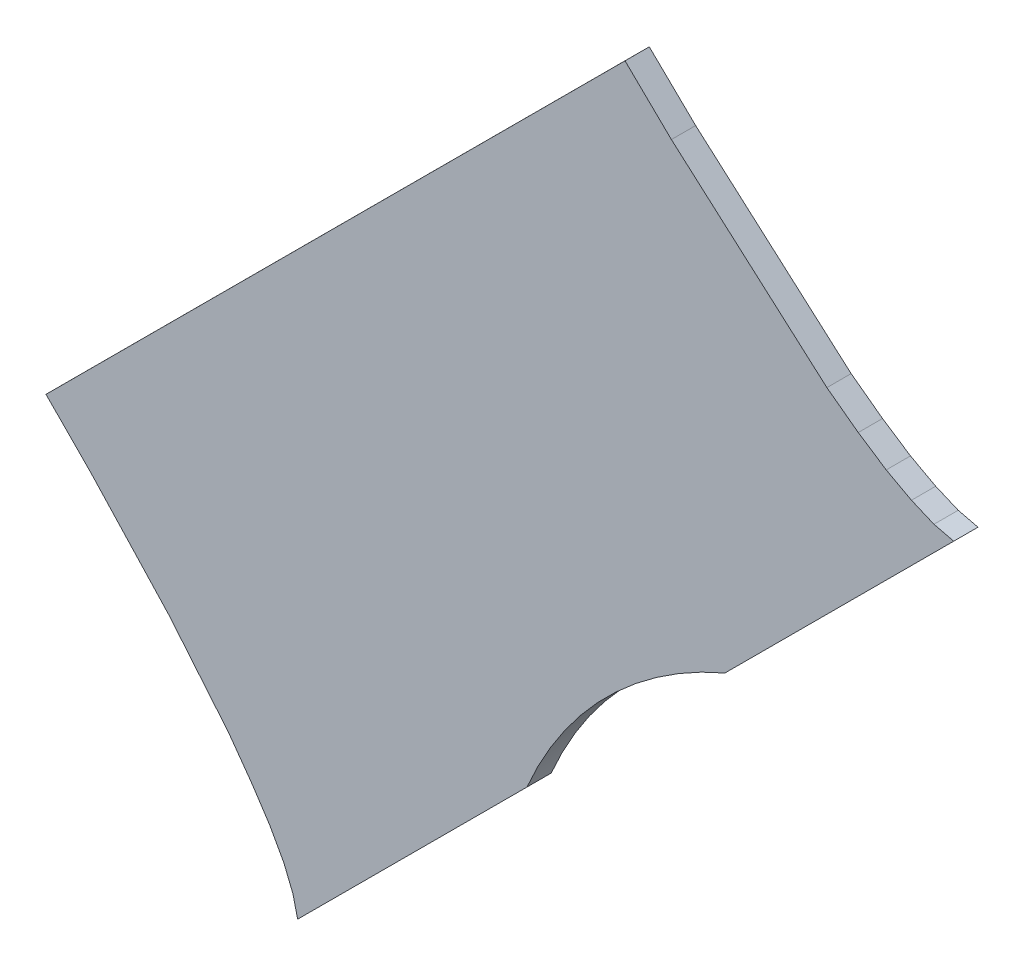
ISO-10303-21;
HEADER;
FILE_DESCRIPTION(('STEP AP214'),'2;1');
FILE_NAME('part.step','',(''),(''),'','','');
FILE_SCHEMA(('AUTOMOTIVE_DESIGN { 1 0 10303 214 1 1 1 1 }'));
ENDSEC;
DATA;
#1=APPLICATION_CONTEXT('core data for automotive mechanical design processes');
#2=APPLICATION_PROTOCOL_DEFINITION('international standard','automotive_design',2000,#1);
#3=PRODUCT_CONTEXT('',#1,'mechanical');
#4=PRODUCT('Part','Part','',(#3));
#5=PRODUCT_RELATED_PRODUCT_CATEGORY('part','',(#4));
#6=PRODUCT_DEFINITION_FORMATION('','',#4);
#7=PRODUCT_DEFINITION_CONTEXT('part definition',#1,'design');
#8=PRODUCT_DEFINITION('design','',#6,#7);
#9=PRODUCT_DEFINITION_SHAPE('','',#8);
#10=(LENGTH_UNIT() NAMED_UNIT(*) SI_UNIT(.MILLI.,.METRE.));
#11=(NAMED_UNIT(*) PLANE_ANGLE_UNIT() SI_UNIT($,.RADIAN.));
#12=(NAMED_UNIT(*) SI_UNIT($,.STERADIAN.) SOLID_ANGLE_UNIT());
#13=UNCERTAINTY_MEASURE_WITH_UNIT(LENGTH_MEASURE(1.E-05),#10,'distance_accuracy_value','');
#14=(GEOMETRIC_REPRESENTATION_CONTEXT(3) GLOBAL_UNCERTAINTY_ASSIGNED_CONTEXT((#13)) GLOBAL_UNIT_ASSIGNED_CONTEXT((#10,
#11,#12)) REPRESENTATION_CONTEXT('',''));
#15=CARTESIAN_POINT('',(0.,0.,0.));
#16=DIRECTION('',(0.,0.,1.));
#17=DIRECTION('',(1.,0.,0.));
#18=AXIS2_PLACEMENT_3D('',#15,#16,#17);
#19=CARTESIAN_POINT('',(85.379997253418,71.8410034179688,0.));
#20=DIRECTION('',(0.706693389429742,-0.707519931405683,0.));
#21=DIRECTION('',(-0.707519931405683,-0.706693389429742,0.));
#22=AXIS2_PLACEMENT_3D('',#19,#20,#21);
#23=PLANE('',#22);
#24=DIRECTION('',(-0.707519931405683,-0.706693389429742,0.));
#25=VECTOR('',#24,1.);
#26=CARTESIAN_POINT('',(85.379997253418,71.8410034179688,0.03556));
#27=LINE('',#26,#25);
#28=CARTESIAN_POINT('',(85.379997253418,71.8410034179688,0.03556));
#29=VERTEX_POINT('',#28);
#30=CARTESIAN_POINT('',(84.5309982299805,70.9929962158203,0.03556));
#31=VERTEX_POINT('',#30);
#32=EDGE_CURVE('E11',#29,#31,#27,.T.);
#33=ORIENTED_EDGE('',*,*,#32,.F.);
#34=DIRECTION('',(0.,0.,1.));
#35=VECTOR('',#34,1.);
#36=CARTESIAN_POINT('',(85.379997253418,71.8410034179688,0.));
#37=LINE('',#36,#35);
#38=CARTESIAN_POINT('',(85.379997253418,71.8410034179688,0.));
#39=VERTEX_POINT('',#38);
#40=EDGE_CURVE('E24',#39,#29,#37,.T.);
#41=ORIENTED_EDGE('',*,*,#40,.F.);
#42=DIRECTION('',(-0.707519931405683,-0.706693389429742,0.));
#43=VECTOR('',#42,1.);
#44=CARTESIAN_POINT('',(85.379997253418,71.8410034179688,0.));
#45=LINE('',#44,#43);
#46=CARTESIAN_POINT('',(84.5309982299805,70.9929962158203,0.));
#47=VERTEX_POINT('',#46);
#48=EDGE_CURVE('E297',#39,#47,#45,.T.);
#49=ORIENTED_EDGE('',*,*,#48,.T.);
#50=DIRECTION('',(0.,0.,1.));
#51=VECTOR('',#50,1.);
#52=CARTESIAN_POINT('',(84.5309982299805,70.9929962158203,0.));
#53=LINE('',#52,#51);
#54=EDGE_CURVE('E37',#47,#31,#53,.T.);
#55=ORIENTED_EDGE('',*,*,#54,.T.);
#56=EDGE_LOOP('',(#33,#41,#49,#55));
#57=FACE_BOUND('',#56,.T.);
#58=ADVANCED_FACE('F17',(#57),#23,.F.);
#59=CARTESIAN_POINT('',(85.447998046875,71.7750015258789,0.));
#60=DIRECTION('',(-0.69648147357691,-0.717574774475899,0.));
#61=DIRECTION('',(-0.717574774475899,0.69648147357691,0.));
#62=AXIS2_PLACEMENT_3D('',#59,#60,#61);
#63=PLANE('',#62);
#64=DIRECTION('',(-0.717574774475898,0.69648147357691,0.));
#65=VECTOR('',#64,1.);
#66=CARTESIAN_POINT('',(85.447998046875,71.7750015258789,0.03556));
#67=LINE('',#66,#65);
#68=CARTESIAN_POINT('',(85.447998046875,71.7750015258789,0.03556));
#69=VERTEX_POINT('',#68);
#70=EDGE_CURVE('E293',#69,#29,#67,.T.);
#71=ORIENTED_EDGE('',*,*,#70,.F.);
#72=DIRECTION('',(0.,0.,1.));
#73=VECTOR('',#72,1.);
#74=CARTESIAN_POINT('',(85.447998046875,71.7750015258789,0.));
#75=LINE('',#74,#73);
#76=CARTESIAN_POINT('',(85.447998046875,71.7750015258789,0.));
#77=VERTEX_POINT('',#76);
#78=EDGE_CURVE('E291',#77,#69,#75,.T.);
#79=ORIENTED_EDGE('',*,*,#78,.F.);
#80=DIRECTION('',(-0.717574774475898,0.69648147357691,0.));
#81=VECTOR('',#80,1.);
#82=CARTESIAN_POINT('',(85.447998046875,71.7750015258789,0.));
#83=LINE('',#82,#81);
#84=EDGE_CURVE('E289',#77,#39,#83,.T.);
#85=ORIENTED_EDGE('',*,*,#84,.T.);
#86=ORIENTED_EDGE('',*,*,#40,.T.);
#87=EDGE_LOOP('',(#71,#79,#85,#86));
#88=FACE_BOUND('',#87,.T.);
#89=ADVANCED_FACE('F300',(#88),#63,.F.);
#90=CARTESIAN_POINT('',(85.6760025024414,71.5739974975586,0.));
#91=DIRECTION('',(-0.661295318004466,-0.750125657730338,0.));
#92=DIRECTION('',(-0.750125657730338,0.661295318004466,0.));
#93=AXIS2_PLACEMENT_3D('',#90,#91,#92);
#94=PLANE('',#93);
#95=DIRECTION('',(-0.750125657730338,0.661295318004466,0.));
#96=VECTOR('',#95,1.);
#97=CARTESIAN_POINT('',(85.6760025024414,71.5739974975586,0.03556));
#98=LINE('',#97,#96);
#99=CARTESIAN_POINT('',(85.6760025024414,71.5739974975586,0.03556));
#100=VERTEX_POINT('',#99);
#101=EDGE_CURVE('E286',#100,#69,#98,.T.);
#102=ORIENTED_EDGE('',*,*,#101,.F.);
#103=DIRECTION('',(0.,0.,1.));
#104=VECTOR('',#103,1.);
#105=CARTESIAN_POINT('',(85.6760025024414,71.5739974975586,0.));
#106=LINE('',#105,#104);
#107=CARTESIAN_POINT('',(85.6760025024414,71.5739974975586,0.));
#108=VERTEX_POINT('',#107);
#109=EDGE_CURVE('E284',#108,#100,#106,.T.);
#110=ORIENTED_EDGE('',*,*,#109,.F.);
#111=DIRECTION('',(-0.750125657730338,0.661295318004466,0.));
#112=VECTOR('',#111,1.);
#113=CARTESIAN_POINT('',(85.6760025024414,71.5739974975586,0.));
#114=LINE('',#113,#112);
#115=EDGE_CURVE('E281',#108,#77,#114,.T.);
#116=ORIENTED_EDGE('',*,*,#115,.T.);
#117=ORIENTED_EDGE('',*,*,#78,.T.);
#118=EDGE_LOOP('',(#102,#110,#116,#117));
#119=FACE_BOUND('',#118,.T.);
#120=ADVANCED_FACE('F303',(#119),#94,.F.);
#121=CARTESIAN_POINT('',(85.7220001220703,71.5400009155273,0.));
#122=DIRECTION('',(-0.594372308476259,-0.804190001751205,0.));
#123=DIRECTION('',(-0.804190001751205,0.594372308476259,0.));
#124=AXIS2_PLACEMENT_3D('',#121,#122,#123);
#125=PLANE('',#124);
#126=DIRECTION('',(-0.804190001751205,0.594372308476259,0.));
#127=VECTOR('',#126,1.);
#128=CARTESIAN_POINT('',(85.7220001220703,71.5400009155273,0.03556));
#129=LINE('',#128,#127);
#130=CARTESIAN_POINT('',(85.7220001220703,71.5400009155273,0.03556));
#131=VERTEX_POINT('',#130);
#132=EDGE_CURVE('E278',#131,#100,#129,.T.);
#133=ORIENTED_EDGE('',*,*,#132,.F.);
#134=DIRECTION('',(0.,0.,1.));
#135=VECTOR('',#134,1.);
#136=CARTESIAN_POINT('',(85.7220001220703,71.5400009155273,0.));
#137=LINE('',#136,#135);
#138=CARTESIAN_POINT('',(85.7220001220703,71.5400009155273,0.));
#139=VERTEX_POINT('',#138);
#140=EDGE_CURVE('E276',#139,#131,#137,.T.);
#141=ORIENTED_EDGE('',*,*,#140,.F.);
#142=DIRECTION('',(-0.804190001751205,0.594372308476259,0.));
#143=VECTOR('',#142,1.);
#144=CARTESIAN_POINT('',(85.7220001220703,71.5400009155273,0.));
#145=LINE('',#144,#143);
#146=EDGE_CURVE('E273',#139,#108,#145,.T.);
#147=ORIENTED_EDGE('',*,*,#146,.T.);
#148=ORIENTED_EDGE('',*,*,#109,.T.);
#149=EDGE_LOOP('',(#133,#141,#147,#148));
#150=FACE_BOUND('',#149,.T.);
#151=ADVANCED_FACE('F308',(#150),#125,.F.);
#152=CARTESIAN_POINT('',(85.7630004882812,71.5130004882812,0.));
#153=DIRECTION('',(-0.549993213403991,-0.835169123716599,0.));
#154=DIRECTION('',(-0.835169123716599,0.549993213403991,0.));
#155=AXIS2_PLACEMENT_3D('',#152,#153,#154);
#156=PLANE('',#155);
#157=DIRECTION('',(-0.835169123716599,0.549993213403991,0.));
#158=VECTOR('',#157,1.);
#159=CARTESIAN_POINT('',(85.7630004882812,71.5130004882812,0.03556));
#160=LINE('',#159,#158);
#161=CARTESIAN_POINT('',(85.7630004882812,71.5130004882812,0.03556));
#162=VERTEX_POINT('',#161);
#163=EDGE_CURVE('E270',#162,#131,#160,.T.);
#164=ORIENTED_EDGE('',*,*,#163,.F.);
#165=DIRECTION('',(0.,0.,1.));
#166=VECTOR('',#165,1.);
#167=CARTESIAN_POINT('',(85.7630004882812,71.5130004882812,0.));
#168=LINE('',#167,#166);
#169=CARTESIAN_POINT('',(85.7630004882812,71.5130004882812,0.));
#170=VERTEX_POINT('',#169);
#171=EDGE_CURVE('E268',#170,#162,#168,.T.);
#172=ORIENTED_EDGE('',*,*,#171,.F.);
#173=DIRECTION('',(-0.835169123716599,0.549993213403991,0.));
#174=VECTOR('',#173,1.);
#175=CARTESIAN_POINT('',(85.7630004882812,71.5130004882812,0.));
#176=LINE('',#175,#174);
#177=EDGE_CURVE('E265',#170,#139,#176,.T.);
#178=ORIENTED_EDGE('',*,*,#177,.T.);
#179=ORIENTED_EDGE('',*,*,#140,.T.);
#180=EDGE_LOOP('',(#164,#172,#178,#179));
#181=FACE_BOUND('',#180,.T.);
#182=ADVANCED_FACE('F311',(#181),#156,.F.);
#183=CARTESIAN_POINT('',(85.8000030517578,71.4929962158203,0.));
#184=DIRECTION('',(-0.475570144418548,-0.879677803367643,0.));
#185=DIRECTION('',(-0.879677803367643,0.475570144418548,0.));
#186=AXIS2_PLACEMENT_3D('',#183,#184,#185);
#187=PLANE('',#186);
#188=DIRECTION('',(-0.879677803367643,0.475570144418548,0.));
#189=VECTOR('',#188,1.);
#190=CARTESIAN_POINT('',(85.8000030517578,71.4929962158203,0.03556));
#191=LINE('',#190,#189);
#192=CARTESIAN_POINT('',(85.8000030517578,71.4929962158203,0.03556));
#193=VERTEX_POINT('',#192);
#194=EDGE_CURVE('E262',#193,#162,#191,.T.);
#195=ORIENTED_EDGE('',*,*,#194,.F.);
#196=DIRECTION('',(0.,0.,1.));
#197=VECTOR('',#196,1.);
#198=CARTESIAN_POINT('',(85.8000030517578,71.4929962158203,0.));
#199=LINE('',#198,#197);
#200=CARTESIAN_POINT('',(85.8000030517578,71.4929962158203,0.));
#201=VERTEX_POINT('',#200);
#202=EDGE_CURVE('E260',#201,#193,#199,.T.);
#203=ORIENTED_EDGE('',*,*,#202,.F.);
#204=DIRECTION('',(-0.879677803367643,0.475570144418548,0.));
#205=VECTOR('',#204,1.);
#206=CARTESIAN_POINT('',(85.8000030517578,71.4929962158203,0.));
#207=LINE('',#206,#205);
#208=EDGE_CURVE('E257',#201,#170,#207,.T.);
#209=ORIENTED_EDGE('',*,*,#208,.T.);
#210=ORIENTED_EDGE('',*,*,#171,.T.);
#211=EDGE_LOOP('',(#195,#203,#209,#210));
#212=FACE_BOUND('',#211,.T.);
#213=ADVANCED_FACE('F316',(#212),#187,.F.);
#214=CARTESIAN_POINT('',(85.8330001831055,71.4789962768555,0.));
#215=DIRECTION('',(-0.390577177437888,-0.920570186604287,0.));
#216=DIRECTION('',(-0.920570186604287,0.390577177437888,0.));
#217=AXIS2_PLACEMENT_3D('',#214,#215,#216);
#218=PLANE('',#217);
#219=DIRECTION('',(-0.920570186604287,0.390577177437888,0.));
#220=VECTOR('',#219,1.);
#221=CARTESIAN_POINT('',(85.8330001831055,71.4789962768555,0.03556));
#222=LINE('',#221,#220);
#223=CARTESIAN_POINT('',(85.8330001831055,71.4789962768555,0.03556));
#224=VERTEX_POINT('',#223);
#225=EDGE_CURVE('E254',#224,#193,#222,.T.);
#226=ORIENTED_EDGE('',*,*,#225,.F.);
#227=DIRECTION('',(0.,0.,1.));
#228=VECTOR('',#227,1.);
#229=CARTESIAN_POINT('',(85.8330001831055,71.4789962768555,0.));
#230=LINE('',#229,#228);
#231=CARTESIAN_POINT('',(85.8330001831055,71.4789962768555,0.));
#232=VERTEX_POINT('',#231);
#233=EDGE_CURVE('E252',#232,#224,#230,.T.);
#234=ORIENTED_EDGE('',*,*,#233,.F.);
#235=DIRECTION('',(-0.920570186604287,0.390577177437888,0.));
#236=VECTOR('',#235,1.);
#237=CARTESIAN_POINT('',(85.8330001831055,71.4789962768555,0.));
#238=LINE('',#237,#236);
#239=EDGE_CURVE('E249',#232,#201,#238,.T.);
#240=ORIENTED_EDGE('',*,*,#239,.T.);
#241=ORIENTED_EDGE('',*,*,#202,.T.);
#242=EDGE_LOOP('',(#226,#234,#240,#241));
#243=FACE_BOUND('',#242,.T.);
#244=ADVANCED_FACE('F319',(#243),#218,.F.);
#245=CARTESIAN_POINT('',(85.8619995117188,71.4720001220703,0.));
#246=DIRECTION('',(-0.234523862882791,-0.972110362941644,0.));
#247=DIRECTION('',(-0.972110362941644,0.234523862882791,0.));
#248=AXIS2_PLACEMENT_3D('',#245,#246,#247);
#249=PLANE('',#248);
#250=DIRECTION('',(-0.972110362941644,0.234523862882791,0.));
#251=VECTOR('',#250,1.);
#252=CARTESIAN_POINT('',(85.8619995117188,71.4720001220703,0.03556));
#253=LINE('',#252,#251);
#254=CARTESIAN_POINT('',(85.8619995117188,71.4720001220703,0.03556));
#255=VERTEX_POINT('',#254);
#256=EDGE_CURVE('E246',#255,#224,#253,.T.);
#257=ORIENTED_EDGE('',*,*,#256,.F.);
#258=DIRECTION('',(0.,0.,1.));
#259=VECTOR('',#258,1.);
#260=CARTESIAN_POINT('',(85.8619995117188,71.4720001220703,0.));
#261=LINE('',#260,#259);
#262=CARTESIAN_POINT('',(85.8619995117188,71.4720001220703,0.));
#263=VERTEX_POINT('',#262);
#264=EDGE_CURVE('E244',#263,#255,#261,.T.);
#265=ORIENTED_EDGE('',*,*,#264,.F.);
#266=DIRECTION('',(-0.972110362941644,0.234523862882791,0.));
#267=VECTOR('',#266,1.);
#268=CARTESIAN_POINT('',(85.8619995117188,71.4720001220703,0.));
#269=LINE('',#268,#267);
#270=EDGE_CURVE('E241',#263,#232,#269,.T.);
#271=ORIENTED_EDGE('',*,*,#270,.T.);
#272=ORIENTED_EDGE('',*,*,#233,.T.);
#273=EDGE_LOOP('',(#257,#265,#271,#272));
#274=FACE_BOUND('',#273,.T.);
#275=ADVANCED_FACE('F324',(#274),#249,.F.);
#276=CARTESIAN_POINT('',(85.5265213490849,71.136870498502,0.));
#277=DIRECTION('',(-0.70673917682214,0.707474194543351,0.));
#278=DIRECTION('',(0.707474194543351,0.70673917682214,0.));
#279=AXIS2_PLACEMENT_3D('',#276,#277,#278);
#280=PLANE('',#279);
#281=DIRECTION('',(0.707474194543351,0.70673917682214,0.));
#282=VECTOR('',#281,1.);
#283=CARTESIAN_POINT('',(84.9000015258789,70.5110015869141,0.03556));
#284=LINE('',#283,#282);
#285=CARTESIAN_POINT('',(85.5265213490849,71.136870498502,0.03556));
#286=VERTEX_POINT('',#285);
#287=EDGE_CURVE('E238',#286,#255,#284,.T.);
#288=ORIENTED_EDGE('',*,*,#287,.F.);
#289=DIRECTION('',(0.,0.,1.));
#290=VECTOR('',#289,1.);
#291=CARTESIAN_POINT('',(85.5265213490849,71.136870498502,0.));
#292=LINE('',#291,#290);
#293=CARTESIAN_POINT('',(85.5265213490849,71.136870498502,0.));
#294=VERTEX_POINT('',#293);
#295=EDGE_CURVE('E236',#294,#286,#292,.T.);
#296=ORIENTED_EDGE('',*,*,#295,.F.);
#297=DIRECTION('',(0.707474194543351,0.70673917682214,0.));
#298=VECTOR('',#297,1.);
#299=CARTESIAN_POINT('',(84.9000015258789,70.5110015869141,0.));
#300=LINE('',#299,#298);
#301=EDGE_CURVE('E233',#294,#263,#300,.T.);
#302=ORIENTED_EDGE('',*,*,#301,.T.);
#303=ORIENTED_EDGE('',*,*,#264,.T.);
#304=EDGE_LOOP('',(#288,#296,#302,#303));
#305=FACE_BOUND('',#304,.T.);
#306=ADVANCED_FACE('F327',(#305),#280,.F.);
#307=CARTESIAN_POINT('',(85.742018,70.6308468,0.));
#308=DIRECTION('',(0.,0.,-1.));
#309=DIRECTION('',(1.,0.,0.));
#310=AXIS2_PLACEMENT_3D('',#307,#308,#309);
#311=CYLINDRICAL_SURFACE('',#310,0.5499989);
#312=ORIENTED_EDGE('',*,*,#295,.T.);
#313=CARTESIAN_POINT('',(85.742018,70.6308468,0.03556));
#314=DIRECTION('',(0.,0.,1.));
#315=DIRECTION('',(1.,0.,0.));
#316=AXIS2_PLACEMENT_3D('',#313,#314,#315);
#317=CIRCLE('',#316,0.5499989);
#318=CARTESIAN_POINT('',(85.2362185775888,70.8468693319028,0.03556));
#319=VERTEX_POINT('',#318);
#320=EDGE_CURVE('E230',#286,#319,#317,.T.);
#321=ORIENTED_EDGE('',*,*,#320,.T.);
#322=DIRECTION('',(0.,0.,1.));
#323=VECTOR('',#322,1.);
#324=CARTESIAN_POINT('',(85.2362185775888,70.8468693319028,0.));
#325=LINE('',#324,#323);
#326=CARTESIAN_POINT('',(85.2362185775888,70.8468693319028,0.));
#327=VERTEX_POINT('',#326);
#328=EDGE_CURVE('E228',#327,#319,#325,.T.);
#329=ORIENTED_EDGE('',*,*,#328,.F.);
#330=CARTESIAN_POINT('',(85.742018,70.6308468,0.));
#331=DIRECTION('',(0.,0.,1.));
#332=DIRECTION('',(1.,0.,0.));
#333=AXIS2_PLACEMENT_3D('',#330,#331,#332);
#334=CIRCLE('',#333,0.5499989);
#335=EDGE_CURVE('E225',#294,#327,#334,.T.);
#336=ORIENTED_EDGE('',*,*,#335,.F.);
#337=EDGE_LOOP('',(#312,#321,#329,#336));
#338=FACE_BOUND('',#337,.T.);
#339=ADVANCED_FACE('F333',(#338),#311,.F.);
#340=CARTESIAN_POINT('',(84.9000015258789,70.5110015869141,0.));
#341=DIRECTION('',(-0.70673917682214,0.707474194543351,0.));
#342=DIRECTION('',(0.707474194543351,0.70673917682214,0.));
#343=AXIS2_PLACEMENT_3D('',#340,#341,#342);
#344=PLANE('',#343);
#345=DIRECTION('',(0.707474194543351,0.70673917682214,0.));
#346=VECTOR('',#345,1.);
#347=CARTESIAN_POINT('',(84.9000015258789,70.5110015869141,0.03556));
#348=LINE('',#347,#346);
#349=CARTESIAN_POINT('',(84.9000015258789,70.5110015869141,0.03556));
#350=VERTEX_POINT('',#349);
#351=EDGE_CURVE('E222',#350,#319,#348,.T.);
#352=ORIENTED_EDGE('',*,*,#351,.F.);
#353=DIRECTION('',(0.,0.,1.));
#354=VECTOR('',#353,1.);
#355=CARTESIAN_POINT('',(84.9000015258789,70.5110015869141,0.));
#356=LINE('',#355,#354);
#357=CARTESIAN_POINT('',(84.9000015258789,70.5110015869141,0.));
#358=VERTEX_POINT('',#357);
#359=EDGE_CURVE('E220',#358,#350,#356,.T.);
#360=ORIENTED_EDGE('',*,*,#359,.F.);
#361=EDGE_CURVE('E219',#358,#327,#300,.T.);
#362=ORIENTED_EDGE('',*,*,#361,.T.);
#363=ORIENTED_EDGE('',*,*,#328,.T.);
#364=EDGE_LOOP('',(#352,#360,#362,#363));
#365=FACE_BOUND('',#364,.T.);
#366=ADVANCED_FACE('F336',(#365),#344,.F.);
#367=CARTESIAN_POINT('',(84.8929977416992,70.5400009155273,0.));
#368=DIRECTION('',(0.972052029451722,0.234765525660795,0.));
#369=DIRECTION('',(0.234765525660795,-0.972052029451722,0.));
#370=AXIS2_PLACEMENT_3D('',#367,#368,#369);
#371=PLANE('',#370);
#372=DIRECTION('',(0.234765525660795,-0.972052029451722,0.));
#373=VECTOR('',#372,1.);
#374=CARTESIAN_POINT('',(84.8929977416992,70.5400009155273,0.03556));
#375=LINE('',#374,#373);
#376=CARTESIAN_POINT('',(84.8929977416992,70.5400009155273,0.03556));
#377=VERTEX_POINT('',#376);
#378=EDGE_CURVE('E216',#377,#350,#375,.T.);
#379=ORIENTED_EDGE('',*,*,#378,.F.);
#380=DIRECTION('',(0.,0.,1.));
#381=VECTOR('',#380,1.);
#382=CARTESIAN_POINT('',(84.8929977416992,70.5400009155273,0.));
#383=LINE('',#382,#381);
#384=CARTESIAN_POINT('',(84.8929977416992,70.5400009155273,0.));
#385=VERTEX_POINT('',#384);
#386=EDGE_CURVE('E214',#385,#377,#383,.T.);
#387=ORIENTED_EDGE('',*,*,#386,.F.);
#388=DIRECTION('',(0.234765525660795,-0.972052029451722,0.));
#389=VECTOR('',#388,1.);
#390=CARTESIAN_POINT('',(84.8929977416992,70.5400009155273,0.));
#391=LINE('',#390,#389);
#392=EDGE_CURVE('E211',#385,#358,#391,.T.);
#393=ORIENTED_EDGE('',*,*,#392,.T.);
#394=ORIENTED_EDGE('',*,*,#359,.T.);
#395=EDGE_LOOP('',(#379,#387,#393,#394));
#396=FACE_BOUND('',#395,.T.);
#397=ADVANCED_FACE('F341',(#396),#371,.F.);
#398=CARTESIAN_POINT('',(84.879997253418,70.5719985961914,0.));
#399=DIRECTION('',(0.926452133729281,0.376412597967261,0.));
#400=DIRECTION('',(0.376412597967261,-0.926452133729281,0.));
#401=AXIS2_PLACEMENT_3D('',#398,#399,#400);
#402=PLANE('',#401);
#403=DIRECTION('',(0.376412597967261,-0.926452133729281,0.));
#404=VECTOR('',#403,1.);
#405=CARTESIAN_POINT('',(84.879997253418,70.5719985961914,0.03556));
#406=LINE('',#405,#404);
#407=CARTESIAN_POINT('',(84.879997253418,70.5719985961914,0.03556));
#408=VERTEX_POINT('',#407);
#409=EDGE_CURVE('E208',#408,#377,#406,.T.);
#410=ORIENTED_EDGE('',*,*,#409,.F.);
#411=DIRECTION('',(0.,0.,1.));
#412=VECTOR('',#411,1.);
#413=CARTESIAN_POINT('',(84.879997253418,70.5719985961914,0.));
#414=LINE('',#413,#412);
#415=CARTESIAN_POINT('',(84.879997253418,70.5719985961914,0.));
#416=VERTEX_POINT('',#415);
#417=EDGE_CURVE('E206',#416,#408,#414,.T.);
#418=ORIENTED_EDGE('',*,*,#417,.F.);
#419=DIRECTION('',(0.376412597967261,-0.926452133729281,0.));
#420=VECTOR('',#419,1.);
#421=CARTESIAN_POINT('',(84.879997253418,70.5719985961914,0.));
#422=LINE('',#421,#420);
#423=EDGE_CURVE('E203',#416,#385,#422,.T.);
#424=ORIENTED_EDGE('',*,*,#423,.T.);
#425=ORIENTED_EDGE('',*,*,#386,.T.);
#426=EDGE_LOOP('',(#410,#418,#424,#425));
#427=FACE_BOUND('',#426,.T.);
#428=ADVANCED_FACE('F344',(#427),#402,.F.);
#429=CARTESIAN_POINT('',(84.859001159668,70.6100006103516,0.));
#430=DIRECTION('',(0.875290473172317,0.483597547113073,0.));
#431=DIRECTION('',(0.483597547113073,-0.875290473172317,0.));
#432=AXIS2_PLACEMENT_3D('',#429,#430,#431);
#433=PLANE('',#432);
#434=DIRECTION('',(0.483597547113073,-0.875290473172317,0.));
#435=VECTOR('',#434,1.);
#436=CARTESIAN_POINT('',(84.859001159668,70.6100006103516,0.03556));
#437=LINE('',#436,#435);
#438=CARTESIAN_POINT('',(84.859001159668,70.6100006103516,0.03556));
#439=VERTEX_POINT('',#438);
#440=EDGE_CURVE('E200',#439,#408,#437,.T.);
#441=ORIENTED_EDGE('',*,*,#440,.F.);
#442=DIRECTION('',(0.,0.,1.));
#443=VECTOR('',#442,1.);
#444=CARTESIAN_POINT('',(84.859001159668,70.6100006103516,0.));
#445=LINE('',#444,#443);
#446=CARTESIAN_POINT('',(84.859001159668,70.6100006103516,0.));
#447=VERTEX_POINT('',#446);
#448=EDGE_CURVE('E198',#447,#439,#445,.T.);
#449=ORIENTED_EDGE('',*,*,#448,.F.);
#450=DIRECTION('',(0.483597547113073,-0.875290473172317,0.));
#451=VECTOR('',#450,1.);
#452=CARTESIAN_POINT('',(84.859001159668,70.6100006103516,0.));
#453=LINE('',#452,#451);
#454=EDGE_CURVE('E195',#447,#416,#453,.T.);
#455=ORIENTED_EDGE('',*,*,#454,.T.);
#456=ORIENTED_EDGE('',*,*,#417,.T.);
#457=EDGE_LOOP('',(#441,#449,#455,#456));
#458=FACE_BOUND('',#457,.T.);
#459=ADVANCED_FACE('F349',(#458),#433,.F.);
#460=CARTESIAN_POINT('',(84.8320007324219,70.6510009765625,0.));
#461=DIRECTION('',(0.835169123716599,0.549993213403991,0.));
#462=DIRECTION('',(0.549993213403991,-0.835169123716599,0.));
#463=AXIS2_PLACEMENT_3D('',#460,#461,#462);
#464=PLANE('',#463);
#465=DIRECTION('',(0.549993213403991,-0.835169123716599,0.));
#466=VECTOR('',#465,1.);
#467=CARTESIAN_POINT('',(84.8320007324219,70.6510009765625,0.03556));
#468=LINE('',#467,#466);
#469=CARTESIAN_POINT('',(84.8320007324219,70.6510009765625,0.03556));
#470=VERTEX_POINT('',#469);
#471=EDGE_CURVE('E192',#470,#439,#468,.T.);
#472=ORIENTED_EDGE('',*,*,#471,.F.);
#473=DIRECTION('',(0.,0.,1.));
#474=VECTOR('',#473,1.);
#475=CARTESIAN_POINT('',(84.8320007324219,70.6510009765625,0.));
#476=LINE('',#475,#474);
#477=CARTESIAN_POINT('',(84.8320007324219,70.6510009765625,0.));
#478=VERTEX_POINT('',#477);
#479=EDGE_CURVE('E190',#478,#470,#476,.T.);
#480=ORIENTED_EDGE('',*,*,#479,.F.);
#481=DIRECTION('',(0.549993213403991,-0.835169123716599,0.));
#482=VECTOR('',#481,1.);
#483=CARTESIAN_POINT('',(84.8320007324219,70.6510009765625,0.));
#484=LINE('',#483,#482);
#485=EDGE_CURVE('E187',#478,#447,#484,.T.);
#486=ORIENTED_EDGE('',*,*,#485,.T.);
#487=ORIENTED_EDGE('',*,*,#448,.T.);
#488=EDGE_LOOP('',(#472,#480,#486,#487));
#489=FACE_BOUND('',#488,.T.);
#490=ADVANCED_FACE('F352',(#489),#464,.F.);
#491=CARTESIAN_POINT('',(84.7990036010742,70.6969985961914,0.));
#492=DIRECTION('',(0.812547964283568,0.582894334968723,0.));
#493=DIRECTION('',(0.582894334968723,-0.812547964283568,0.));
#494=AXIS2_PLACEMENT_3D('',#491,#492,#493);
#495=PLANE('',#494);
#496=DIRECTION('',(0.582894334968723,-0.812547964283568,0.));
#497=VECTOR('',#496,1.);
#498=CARTESIAN_POINT('',(84.7990036010742,70.6969985961914,0.03556));
#499=LINE('',#498,#497);
#500=CARTESIAN_POINT('',(84.7990036010742,70.6969985961914,0.03556));
#501=VERTEX_POINT('',#500);
#502=EDGE_CURVE('E184',#501,#470,#499,.T.);
#503=ORIENTED_EDGE('',*,*,#502,.F.);
#504=DIRECTION('',(0.,0.,1.));
#505=VECTOR('',#504,1.);
#506=CARTESIAN_POINT('',(84.7990036010742,70.6969985961914,0.));
#507=LINE('',#506,#505);
#508=CARTESIAN_POINT('',(84.7990036010742,70.6969985961914,0.));
#509=VERTEX_POINT('',#508);
#510=EDGE_CURVE('E182',#509,#501,#507,.T.);
#511=ORIENTED_EDGE('',*,*,#510,.F.);
#512=DIRECTION('',(0.582894334968723,-0.812547964283568,0.));
#513=VECTOR('',#512,1.);
#514=CARTESIAN_POINT('',(84.7990036010742,70.6969985961914,0.));
#515=LINE('',#514,#513);
#516=EDGE_CURVE('E179',#509,#478,#515,.T.);
#517=ORIENTED_EDGE('',*,*,#516,.T.);
#518=ORIENTED_EDGE('',*,*,#479,.T.);
#519=EDGE_LOOP('',(#503,#511,#517,#518));
#520=FACE_BOUND('',#519,.T.);
#521=ADVANCED_FACE('F355',(#520),#495,.F.);
#522=CARTESIAN_POINT('',(84.7119979858399,70.802001953125,0.));
#523=DIRECTION('',(0.77001135152849,0.638030186211647,0.));
#524=DIRECTION('',(0.638030186211647,-0.77001135152849,0.));
#525=AXIS2_PLACEMENT_3D('',#522,#523,#524);
#526=PLANE('',#525);
#527=DIRECTION('',(0.638030186211647,-0.77001135152849,0.));
#528=VECTOR('',#527,1.);
#529=CARTESIAN_POINT('',(84.7119979858398,70.802001953125,0.03556));
#530=LINE('',#529,#528);
#531=CARTESIAN_POINT('',(84.7119979858398,70.802001953125,0.03556));
#532=VERTEX_POINT('',#531);
#533=EDGE_CURVE('E176',#532,#501,#530,.T.);
#534=ORIENTED_EDGE('',*,*,#533,.F.);
#535=DIRECTION('',(0.,0.,1.));
#536=VECTOR('',#535,1.);
#537=CARTESIAN_POINT('',(84.7119979858398,70.802001953125,0.));
#538=LINE('',#537,#536);
#539=CARTESIAN_POINT('',(84.7119979858398,70.802001953125,0.));
#540=VERTEX_POINT('',#539);
#541=EDGE_CURVE('E174',#540,#532,#538,.T.);
#542=ORIENTED_EDGE('',*,*,#541,.F.);
#543=DIRECTION('',(0.638030186211647,-0.77001135152849,0.));
#544=VECTOR('',#543,1.);
#545=CARTESIAN_POINT('',(84.7119979858398,70.802001953125,0.));
#546=LINE('',#545,#544);
#547=EDGE_CURVE('E165',#540,#509,#546,.T.);
#548=ORIENTED_EDGE('',*,*,#547,.T.);
#549=ORIENTED_EDGE('',*,*,#510,.T.);
#550=EDGE_LOOP('',(#534,#542,#548,#549));
#551=FACE_BOUND('',#550,.T.);
#552=ADVANCED_FACE('F358',(#551),#526,.F.);
#553=CARTESIAN_POINT('',(84.5979995727539,70.9250030517578,0.));
#554=DIRECTION('',(0.733438041299544,0.67975630896277,0.));
#555=DIRECTION('',(0.67975630896277,-0.733438041299544,0.));
#556=AXIS2_PLACEMENT_3D('',#553,#554,#555);
#557=PLANE('',#556);
#558=DIRECTION('',(0.67975630896277,-0.733438041299544,0.));
#559=VECTOR('',#558,1.);
#560=CARTESIAN_POINT('',(84.5979995727539,70.9250030517578,0.03556));
#561=LINE('',#560,#559);
#562=CARTESIAN_POINT('',(84.5979995727539,70.9250030517578,0.03556));
#563=VERTEX_POINT('',#562);
#564=EDGE_CURVE('E151',#563,#532,#561,.T.);
#565=ORIENTED_EDGE('',*,*,#564,.F.);
#566=DIRECTION('',(0.,0.,1.));
#567=VECTOR('',#566,1.);
#568=CARTESIAN_POINT('',(84.5979995727539,70.9250030517578,0.));
#569=LINE('',#568,#567);
#570=CARTESIAN_POINT('',(84.5979995727539,70.9250030517578,0.));
#571=VERTEX_POINT('',#570);
#572=EDGE_CURVE('E146',#571,#563,#569,.T.);
#573=ORIENTED_EDGE('',*,*,#572,.F.);
#574=DIRECTION('',(0.67975630896277,-0.733438041299544,0.));
#575=VECTOR('',#574,1.);
#576=CARTESIAN_POINT('',(84.5979995727539,70.9250030517578,0.));
#577=LINE('',#576,#575);
#578=EDGE_CURVE('E149',#571,#540,#577,.T.);
#579=ORIENTED_EDGE('',*,*,#578,.T.);
#580=ORIENTED_EDGE('',*,*,#541,.T.);
#581=EDGE_LOOP('',(#565,#573,#579,#580));
#582=FACE_BOUND('',#581,.T.);
#583=ADVANCED_FACE('F148',(#582),#557,.F.);
#584=CARTESIAN_POINT('',(84.5309982299805,70.9929962158203,0.));
#585=DIRECTION('',(0.712282757576446,0.701892636561529,0.));
#586=DIRECTION('',(0.701892636561529,-0.712282757576446,0.));
#587=AXIS2_PLACEMENT_3D('',#584,#585,#586);
#588=PLANE('',#587);
#589=DIRECTION('',(0.701892636561529,-0.712282757576446,0.));
#590=VECTOR('',#589,1.);
#591=CARTESIAN_POINT('',(84.5309982299805,70.9929962158203,0.03556));
#592=LINE('',#591,#590);
#593=EDGE_CURVE('E166',#31,#563,#592,.T.);
#594=ORIENTED_EDGE('',*,*,#593,.F.);
#595=ORIENTED_EDGE('',*,*,#54,.F.);
#596=DIRECTION('',(0.701892636561529,-0.712282757576446,0.));
#597=VECTOR('',#596,1.);
#598=CARTESIAN_POINT('',(84.5309982299805,70.9929962158203,0.));
#599=LINE('',#598,#597);
#600=EDGE_CURVE('E162',#47,#571,#599,.T.);
#601=ORIENTED_EDGE('',*,*,#600,.T.);
#602=ORIENTED_EDGE('',*,*,#572,.T.);
#603=EDGE_LOOP('',(#594,#595,#601,#602));
#604=FACE_BOUND('',#603,.T.);
#605=ADVANCED_FACE('F168',(#604),#588,.F.);
#606=CARTESIAN_POINT('',(84.5309982299805,70.9929962158203,0.));
#607=DIRECTION('',(0.,0.,1.));
#608=DIRECTION('',(1.,0.,0.));
#609=AXIS2_PLACEMENT_3D('',#606,#607,#608);
#610=PLANE('',#609);
#611=ORIENTED_EDGE('',*,*,#600,.F.);
#612=ORIENTED_EDGE('',*,*,#48,.F.);
#613=ORIENTED_EDGE('',*,*,#84,.F.);
#614=ORIENTED_EDGE('',*,*,#115,.F.);
#615=ORIENTED_EDGE('',*,*,#146,.F.);
#616=ORIENTED_EDGE('',*,*,#177,.F.);
#617=ORIENTED_EDGE('',*,*,#208,.F.);
#618=ORIENTED_EDGE('',*,*,#239,.F.);
#619=ORIENTED_EDGE('',*,*,#270,.F.);
#620=ORIENTED_EDGE('',*,*,#301,.F.);
#621=ORIENTED_EDGE('',*,*,#335,.T.);
#622=ORIENTED_EDGE('',*,*,#361,.F.);
#623=ORIENTED_EDGE('',*,*,#392,.F.);
#624=ORIENTED_EDGE('',*,*,#423,.F.);
#625=ORIENTED_EDGE('',*,*,#454,.F.);
#626=ORIENTED_EDGE('',*,*,#485,.F.);
#627=ORIENTED_EDGE('',*,*,#516,.F.);
#628=ORIENTED_EDGE('',*,*,#547,.F.);
#629=ORIENTED_EDGE('',*,*,#578,.F.);
#630=EDGE_LOOP('',(#611,#612,#613,#614,#615,#616,#617,#618,#619,#620,#621,#622,#623,#624,#625,
#626,#627,#628,#629));
#631=FACE_BOUND('',#630,.T.);
#632=ADVANCED_FACE('F160',(#631),#610,.F.);
#633=CARTESIAN_POINT('',(84.5309982299805,70.9929962158203,0.03556));
#634=DIRECTION('',(0.,0.,1.));
#635=DIRECTION('',(1.,0.,0.));
#636=AXIS2_PLACEMENT_3D('',#633,#634,#635);
#637=PLANE('',#636);
#638=ORIENTED_EDGE('',*,*,#32,.T.);
#639=ORIENTED_EDGE('',*,*,#593,.T.);
#640=ORIENTED_EDGE('',*,*,#564,.T.);
#641=ORIENTED_EDGE('',*,*,#533,.T.);
#642=ORIENTED_EDGE('',*,*,#502,.T.);
#643=ORIENTED_EDGE('',*,*,#471,.T.);
#644=ORIENTED_EDGE('',*,*,#440,.T.);
#645=ORIENTED_EDGE('',*,*,#409,.T.);
#646=ORIENTED_EDGE('',*,*,#378,.T.);
#647=ORIENTED_EDGE('',*,*,#351,.T.);
#648=ORIENTED_EDGE('',*,*,#320,.F.);
#649=ORIENTED_EDGE('',*,*,#287,.T.);
#650=ORIENTED_EDGE('',*,*,#256,.T.);
#651=ORIENTED_EDGE('',*,*,#225,.T.);
#652=ORIENTED_EDGE('',*,*,#194,.T.);
#653=ORIENTED_EDGE('',*,*,#163,.T.);
#654=ORIENTED_EDGE('',*,*,#132,.T.);
#655=ORIENTED_EDGE('',*,*,#101,.T.);
#656=ORIENTED_EDGE('',*,*,#70,.T.);
#657=EDGE_LOOP('',(#638,#639,#640,#641,#642,#643,#644,#645,#646,#647,#648,#649,#650,#651,#652,
#653,#654,#655,#656));
#658=FACE_BOUND('',#657,.T.);
#659=ADVANCED_FACE('F360',(#658),#637,.T.);
#660=CLOSED_SHELL('',(#58,#89,#120,#151,#182,#213,#244,#275,#306,#339,#366,#397,#428,#459,#490,
#521,#552,#583,#605,#632,#659));
#661=MANIFOLD_SOLID_BREP('B1',#660);
#662=ADVANCED_BREP_SHAPE_REPRESENTATION('',(#18,#661),#14);
#663=SHAPE_DEFINITION_REPRESENTATION(#9,#662);
ENDSEC;
END-ISO-10303-21;
